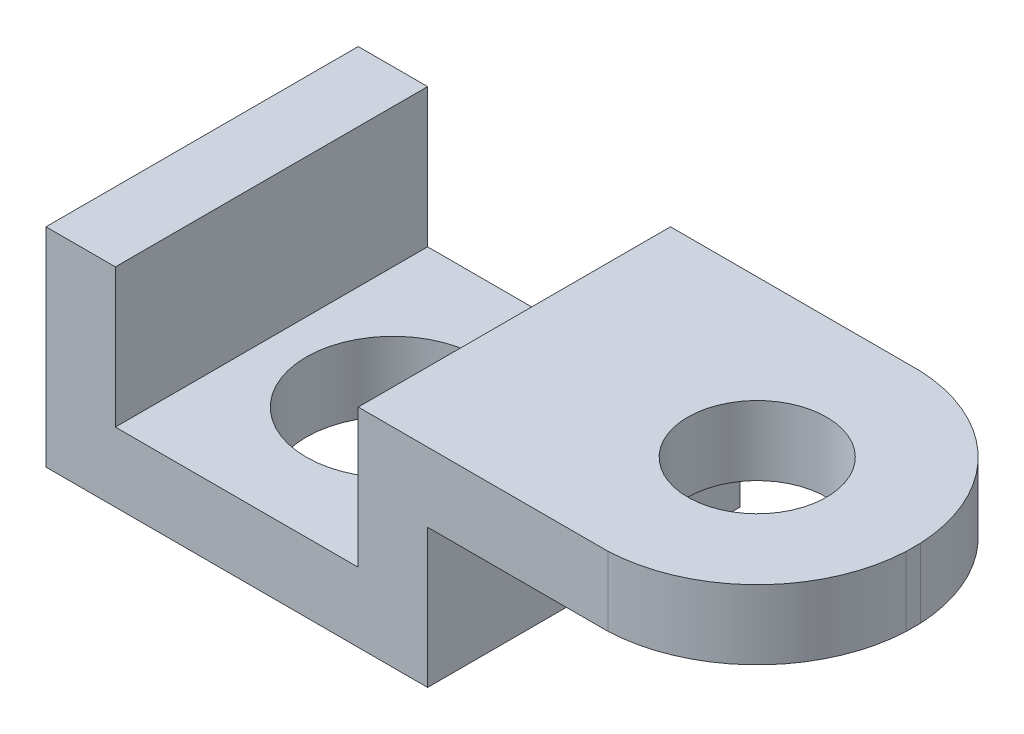
ISO-10303-21;
HEADER;
FILE_DESCRIPTION(('STEP AP214'),'2;1');
FILE_NAME('part.step','',(''),(''),'','','');
FILE_SCHEMA(('AUTOMOTIVE_DESIGN { 1 0 10303 214 1 1 1 1 }'));
ENDSEC;
DATA;
#1=APPLICATION_CONTEXT('core data for automotive mechanical design processes');
#2=APPLICATION_PROTOCOL_DEFINITION('international standard','automotive_design',2000,#1);
#3=PRODUCT_CONTEXT('',#1,'mechanical');
#4=PRODUCT('Part','Part','',(#3));
#5=PRODUCT_RELATED_PRODUCT_CATEGORY('part','',(#4));
#6=PRODUCT_DEFINITION_FORMATION('','',#4);
#7=PRODUCT_DEFINITION_CONTEXT('part definition',#1,'design');
#8=PRODUCT_DEFINITION('design','',#6,#7);
#9=PRODUCT_DEFINITION_SHAPE('','',#8);
#10=(LENGTH_UNIT() NAMED_UNIT(*) SI_UNIT(.MILLI.,.METRE.));
#11=(NAMED_UNIT(*) PLANE_ANGLE_UNIT() SI_UNIT($,.RADIAN.));
#12=(NAMED_UNIT(*) SI_UNIT($,.STERADIAN.) SOLID_ANGLE_UNIT());
#13=UNCERTAINTY_MEASURE_WITH_UNIT(LENGTH_MEASURE(1.E-05),#10,'distance_accuracy_value','');
#14=(GEOMETRIC_REPRESENTATION_CONTEXT(3) GLOBAL_UNCERTAINTY_ASSIGNED_CONTEXT((#13)) GLOBAL_UNIT_ASSIGNED_CONTEXT((#10,
#11,#12)) REPRESENTATION_CONTEXT('',''));
#15=CARTESIAN_POINT('',(0.,0.,0.));
#16=DIRECTION('',(0.,0.,1.));
#17=DIRECTION('',(1.,0.,0.));
#18=AXIS2_PLACEMENT_3D('',#15,#16,#17);
#19=CARTESIAN_POINT('',(0.,38.1,28.575));
#20=DIRECTION('',(1.,0.,0.));
#21=DIRECTION('',(0.,0.,-1.));
#22=AXIS2_PLACEMENT_3D('',#19,#20,#21);
#23=PLANE('',#22);
#24=DIRECTION('',(0.,-1.,0.));
#25=VECTOR('',#24,1.);
#26=CARTESIAN_POINT('',(0.,38.1,-28.575));
#27=LINE('',#26,#25);
#28=CARTESIAN_POINT('',(0.,38.1,-28.575));
#29=VERTEX_POINT('',#28);
#30=CARTESIAN_POINT('',(0.,0.,-28.575));
#31=VERTEX_POINT('',#30);
#32=EDGE_CURVE('E199',#29,#31,#27,.T.);
#33=ORIENTED_EDGE('',*,*,#32,.T.);
#34=DIRECTION('',(0.,0.,-1.));
#35=VECTOR('',#34,1.);
#36=CARTESIAN_POINT('',(0.,0.,28.575));
#37=LINE('',#36,#35);
#38=CARTESIAN_POINT('',(0.,0.,28.575));
#39=VERTEX_POINT('',#38);
#40=EDGE_CURVE('E12',#39,#31,#37,.T.);
#41=ORIENTED_EDGE('',*,*,#40,.F.);
#42=DIRECTION('',(0.,-1.,0.));
#43=VECTOR('',#42,1.);
#44=CARTESIAN_POINT('',(0.,38.1,28.575));
#45=LINE('',#44,#43);
#46=CARTESIAN_POINT('',(0.,38.1,28.575));
#47=VERTEX_POINT('',#46);
#48=EDGE_CURVE('E212',#47,#39,#45,.T.);
#49=ORIENTED_EDGE('',*,*,#48,.F.);
#50=DIRECTION('',(0.,0.,-1.));
#51=VECTOR('',#50,1.);
#52=CARTESIAN_POINT('',(0.,38.1,28.575));
#53=LINE('',#52,#51);
#54=EDGE_CURVE('E213',#47,#29,#53,.T.);
#55=ORIENTED_EDGE('',*,*,#54,.T.);
#56=EDGE_LOOP('',(#33,#41,#49,#55));
#57=FACE_BOUND('',#56,.T.);
#58=ADVANCED_FACE('F64',(#57),#23,.F.);
#59=CARTESIAN_POINT('',(0.,0.,28.575));
#60=DIRECTION('',(0.,1.,0.));
#61=DIRECTION('',(0.,0.,1.));
#62=AXIS2_PLACEMENT_3D('',#59,#60,#61);
#63=PLANE('',#62);
#64=CARTESIAN_POINT('',(34.925,0.,0.));
#65=DIRECTION('',(0.,1.,0.));
#66=DIRECTION('',(-1.,0.,0.));
#67=AXIS2_PLACEMENT_3D('',#64,#65,#66);
#68=CIRCLE('',#67,15.875);
#69=CARTESIAN_POINT('',(19.05,0.,0.));
#70=VERTEX_POINT('',#69);
#71=EDGE_CURVE('E255',#70,#70,#68,.T.);
#72=ORIENTED_EDGE('',*,*,#71,.T.);
#73=EDGE_LOOP('',(#72));
#74=FACE_BOUND('',#73,.T.);
#75=DIRECTION('',(1.,0.,0.));
#76=VECTOR('',#75,1.);
#77=CARTESIAN_POINT('',(0.,0.,-28.575));
#78=LINE('',#77,#76);
#79=CARTESIAN_POINT('',(69.85,0.,-28.575));
#80=VERTEX_POINT('',#79);
#81=EDGE_CURVE('E195',#31,#80,#78,.T.);
#82=ORIENTED_EDGE('',*,*,#81,.T.);
#83=DIRECTION('',(0.,0.,-1.));
#84=VECTOR('',#83,1.);
#85=CARTESIAN_POINT('',(69.85,0.,28.575));
#86=LINE('',#85,#84);
#87=CARTESIAN_POINT('',(69.85,0.,28.575));
#88=VERTEX_POINT('',#87);
#89=EDGE_CURVE('E71',#88,#80,#86,.T.);
#90=ORIENTED_EDGE('',*,*,#89,.F.);
#91=DIRECTION('',(1.,0.,0.));
#92=VECTOR('',#91,1.);
#93=CARTESIAN_POINT('',(0.,0.,28.575));
#94=LINE('',#93,#92);
#95=EDGE_CURVE('E271',#39,#88,#94,.T.);
#96=ORIENTED_EDGE('',*,*,#95,.F.);
#97=ORIENTED_EDGE('',*,*,#40,.T.);
#98=EDGE_LOOP('',(#82,#90,#96,#97));
#99=FACE_BOUND('',#98,.T.);
#100=ADVANCED_FACE('F304',(#74,#99),#63,.F.);
#101=CARTESIAN_POINT('',(69.85,0.,28.575));
#102=DIRECTION('',(-1.,0.,0.));
#103=DIRECTION('',(0.,0.,1.));
#104=AXIS2_PLACEMENT_3D('',#101,#102,#103);
#105=PLANE('',#104);
#106=DIRECTION('',(0.,1.,0.));
#107=VECTOR('',#106,1.);
#108=CARTESIAN_POINT('',(69.85,0.,-28.575));
#109=LINE('',#108,#107);
#110=CARTESIAN_POINT('',(69.85,25.4,-28.575));
#111=VERTEX_POINT('',#110);
#112=EDGE_CURVE('E188',#80,#111,#109,.T.);
#113=ORIENTED_EDGE('',*,*,#112,.T.);
#114=DIRECTION('',(0.,0.,-1.));
#115=VECTOR('',#114,1.);
#116=CARTESIAN_POINT('',(69.85,25.4,28.575));
#117=LINE('',#116,#115);
#118=CARTESIAN_POINT('',(69.85,25.4,28.575));
#119=VERTEX_POINT('',#118);
#120=EDGE_CURVE('E174',#119,#111,#117,.T.);
#121=ORIENTED_EDGE('',*,*,#120,.F.);
#122=DIRECTION('',(0.,1.,0.));
#123=VECTOR('',#122,1.);
#124=CARTESIAN_POINT('',(69.85,0.,28.575));
#125=LINE('',#124,#123);
#126=EDGE_CURVE('E189',#88,#119,#125,.T.);
#127=ORIENTED_EDGE('',*,*,#126,.F.);
#128=ORIENTED_EDGE('',*,*,#89,.T.);
#129=EDGE_LOOP('',(#113,#121,#127,#128));
#130=FACE_BOUND('',#129,.T.);
#131=ADVANCED_FACE('F186',(#130),#105,.F.);
#132=CARTESIAN_POINT('',(69.85,25.4,28.575));
#133=DIRECTION('',(0.,1.,0.));
#134=DIRECTION('',(-1.,0.,0.));
#135=AXIS2_PLACEMENT_3D('',#132,#133,#134);
#136=PLANE('',#135);
#137=CARTESIAN_POINT('',(101.6,25.4,0.));
#138=DIRECTION('',(0.,1.,0.));
#139=DIRECTION('',(-1.,0.,0.));
#140=AXIS2_PLACEMENT_3D('',#137,#138,#139);
#141=CIRCLE('',#140,12.7);
#142=CARTESIAN_POINT('',(88.9,25.4,0.));
#143=VERTEX_POINT('',#142);
#144=EDGE_CURVE('E264',#143,#143,#141,.T.);
#145=ORIENTED_EDGE('',*,*,#144,.T.);
#146=EDGE_LOOP('',(#145));
#147=FACE_BOUND('',#146,.T.);
#148=DIRECTION('',(0.,0.,-1.));
#149=VECTOR('',#148,1.);
#150=CARTESIAN_POINT('',(130.175,25.4,28.575));
#151=LINE('',#150,#149);
#152=CARTESIAN_POINT('',(130.175,25.4,1.2967476767075));
#153=VERTEX_POINT('',#152);
#154=CARTESIAN_POINT('',(130.175,25.4,-1.2967476767075));
#155=VERTEX_POINT('',#154);
#156=EDGE_CURVE('E166',#153,#155,#151,.T.);
#157=ORIENTED_EDGE('',*,*,#156,.F.);
#158=CARTESIAN_POINT('',(101.6,25.4,0.));
#159=DIRECTION('',(0.,1.,0.));
#160=DIRECTION('',(-1.,0.,0.));
#161=AXIS2_PLACEMENT_3D('',#158,#159,#160);
#162=CIRCLE('',#161,28.6044083934111);
#163=CARTESIAN_POINT('',(102.896747676707,25.4,28.575));
#164=VERTEX_POINT('',#163);
#165=EDGE_CURVE('E281',#153,#164,#162,.F.);
#166=ORIENTED_EDGE('',*,*,#165,.T.);
#167=DIRECTION('',(1.,0.,0.));
#168=VECTOR('',#167,1.);
#169=CARTESIAN_POINT('',(69.85,25.4,28.575));
#170=LINE('',#169,#168);
#171=EDGE_CURVE('E274',#119,#164,#170,.T.);
#172=ORIENTED_EDGE('',*,*,#171,.F.);
#173=ORIENTED_EDGE('',*,*,#120,.T.);
#174=DIRECTION('',(1.,0.,0.));
#175=VECTOR('',#174,1.);
#176=CARTESIAN_POINT('',(69.85,25.4,-28.575));
#177=LINE('',#176,#175);
#178=CARTESIAN_POINT('',(102.896747676707,25.4,-28.575));
#179=VERTEX_POINT('',#178);
#180=EDGE_CURVE('E169',#111,#179,#177,.T.);
#181=ORIENTED_EDGE('',*,*,#180,.T.);
#182=CARTESIAN_POINT('',(101.6,25.4,0.));
#183=DIRECTION('',(0.,1.,0.));
#184=DIRECTION('',(-1.,0.,0.));
#185=AXIS2_PLACEMENT_3D('',#182,#183,#184);
#186=CIRCLE('',#185,28.6044083934111);
#187=EDGE_CURVE('E86',#179,#155,#186,.F.);
#188=ORIENTED_EDGE('',*,*,#187,.T.);
#189=EDGE_LOOP('',(#157,#166,#172,#173,#181,#188));
#190=FACE_BOUND('',#189,.T.);
#191=ADVANCED_FACE('F164',(#147,#190),#136,.F.);
#192=CARTESIAN_POINT('',(130.175,25.4,28.575));
#193=DIRECTION('',(-1.,0.,0.));
#194=DIRECTION('',(0.,0.,1.));
#195=AXIS2_PLACEMENT_3D('',#192,#193,#194);
#196=PLANE('',#195);
#197=DIRECTION('',(0.,0.,-1.));
#198=VECTOR('',#197,1.);
#199=CARTESIAN_POINT('',(130.175,38.1,28.575));
#200=LINE('',#199,#198);
#201=CARTESIAN_POINT('',(130.175,38.1,1.2967476767075));
#202=VERTEX_POINT('',#201);
#203=CARTESIAN_POINT('',(130.175,38.1,-1.2967476767075));
#204=VERTEX_POINT('',#203);
#205=EDGE_CURVE('E175',#202,#204,#200,.T.);
#206=ORIENTED_EDGE('',*,*,#205,.F.);
#207=DIRECTION('',(0.,1.,0.));
#208=VECTOR('',#207,1.);
#209=CARTESIAN_POINT('',(130.175,25.4,1.2967476767075));
#210=LINE('',#209,#208);
#211=EDGE_CURVE('E173',#153,#202,#210,.T.);
#212=ORIENTED_EDGE('',*,*,#211,.F.);
#213=ORIENTED_EDGE('',*,*,#156,.T.);
#214=DIRECTION('',(0.,1.,0.));
#215=VECTOR('',#214,1.);
#216=CARTESIAN_POINT('',(130.175,25.4,-1.2967476767075));
#217=LINE('',#216,#215);
#218=EDGE_CURVE('E150',#155,#204,#217,.T.);
#219=ORIENTED_EDGE('',*,*,#218,.T.);
#220=EDGE_LOOP('',(#206,#212,#213,#219));
#221=FACE_BOUND('',#220,.T.);
#222=ADVANCED_FACE('F172',(#221),#196,.F.);
#223=CARTESIAN_POINT('',(130.175,38.1,28.575));
#224=DIRECTION('',(0.,-1.,0.));
#225=DIRECTION('',(1.,0.,0.));
#226=AXIS2_PLACEMENT_3D('',#223,#224,#225);
#227=PLANE('',#226);
#228=CARTESIAN_POINT('',(101.6,38.1,0.));
#229=DIRECTION('',(0.,1.,0.));
#230=DIRECTION('',(-1.,0.,0.));
#231=AXIS2_PLACEMENT_3D('',#228,#229,#230);
#232=CIRCLE('',#231,12.7);
#233=CARTESIAN_POINT('',(88.9,38.1,0.));
#234=VERTEX_POINT('',#233);
#235=EDGE_CURVE('E158',#234,#234,#232,.T.);
#236=ORIENTED_EDGE('',*,*,#235,.F.);
#237=EDGE_LOOP('',(#236));
#238=FACE_BOUND('',#237,.T.);
#239=DIRECTION('',(-1.,0.,0.));
#240=VECTOR('',#239,1.);
#241=CARTESIAN_POINT('',(130.175,38.1,28.575));
#242=LINE('',#241,#240);
#243=CARTESIAN_POINT('',(102.896747676707,38.1,28.575));
#244=VERTEX_POINT('',#243);
#245=CARTESIAN_POINT('',(57.15,38.1,28.575));
#246=VERTEX_POINT('',#245);
#247=EDGE_CURVE('E277',#244,#246,#242,.T.);
#248=ORIENTED_EDGE('',*,*,#247,.F.);
#249=CARTESIAN_POINT('',(101.6,38.1,0.));
#250=DIRECTION('',(0.,1.,0.));
#251=DIRECTION('',(-1.,0.,0.));
#252=AXIS2_PLACEMENT_3D('',#249,#250,#251);
#253=CIRCLE('',#252,28.6044083934111);
#254=EDGE_CURVE('E78',#202,#244,#253,.F.);
#255=ORIENTED_EDGE('',*,*,#254,.F.);
#256=ORIENTED_EDGE('',*,*,#205,.T.);
#257=CARTESIAN_POINT('',(101.6,38.1,0.));
#258=DIRECTION('',(0.,1.,0.));
#259=DIRECTION('',(-1.,0.,0.));
#260=AXIS2_PLACEMENT_3D('',#257,#258,#259);
#261=CIRCLE('',#260,28.6044083934111);
#262=CARTESIAN_POINT('',(102.896747676707,38.1,-28.575));
#263=VERTEX_POINT('',#262);
#264=EDGE_CURVE('E153',#263,#204,#261,.F.);
#265=ORIENTED_EDGE('',*,*,#264,.F.);
#266=DIRECTION('',(-1.,0.,0.));
#267=VECTOR('',#266,1.);
#268=CARTESIAN_POINT('',(130.175,38.1,-28.575));
#269=LINE('',#268,#267);
#270=CARTESIAN_POINT('',(57.15,38.1,-28.575));
#271=VERTEX_POINT('',#270);
#272=EDGE_CURVE('E197',#263,#271,#269,.T.);
#273=ORIENTED_EDGE('',*,*,#272,.T.);
#274=DIRECTION('',(0.,0.,-1.));
#275=VECTOR('',#274,1.);
#276=CARTESIAN_POINT('',(57.15,38.1,28.575));
#277=LINE('',#276,#275);
#278=EDGE_CURVE('E178',#246,#271,#277,.T.);
#279=ORIENTED_EDGE('',*,*,#278,.F.);
#280=EDGE_LOOP('',(#248,#255,#256,#265,#273,#279));
#281=FACE_BOUND('',#280,.T.);
#282=ADVANCED_FACE('F280',(#238,#281),#227,.F.);
#283=CARTESIAN_POINT('',(57.15,38.1,28.575));
#284=DIRECTION('',(1.,0.,0.));
#285=DIRECTION('',(0.,0.,-1.));
#286=AXIS2_PLACEMENT_3D('',#283,#284,#285);
#287=PLANE('',#286);
#288=DIRECTION('',(0.,-1.,0.));
#289=VECTOR('',#288,1.);
#290=CARTESIAN_POINT('',(57.15,38.1,-28.575));
#291=LINE('',#290,#289);
#292=CARTESIAN_POINT('',(57.15,12.7,-28.575));
#293=VERTEX_POINT('',#292);
#294=EDGE_CURVE('E204',#271,#293,#291,.T.);
#295=ORIENTED_EDGE('',*,*,#294,.T.);
#296=DIRECTION('',(0.,0.,-1.));
#297=VECTOR('',#296,1.);
#298=CARTESIAN_POINT('',(57.15,12.7,28.575));
#299=LINE('',#298,#297);
#300=CARTESIAN_POINT('',(57.15,12.7,28.575));
#301=VERTEX_POINT('',#300);
#302=EDGE_CURVE('E223',#301,#293,#299,.T.);
#303=ORIENTED_EDGE('',*,*,#302,.F.);
#304=DIRECTION('',(0.,-1.,0.));
#305=VECTOR('',#304,1.);
#306=CARTESIAN_POINT('',(57.15,38.1,28.575));
#307=LINE('',#306,#305);
#308=EDGE_CURVE('E232',#246,#301,#307,.T.);
#309=ORIENTED_EDGE('',*,*,#308,.F.);
#310=ORIENTED_EDGE('',*,*,#278,.T.);
#311=EDGE_LOOP('',(#295,#303,#309,#310));
#312=FACE_BOUND('',#311,.T.);
#313=ADVANCED_FACE('F230',(#312),#287,.F.);
#314=CARTESIAN_POINT('',(57.15,12.7,28.575));
#315=DIRECTION('',(0.,-1.,0.));
#316=DIRECTION('',(1.,0.,0.));
#317=AXIS2_PLACEMENT_3D('',#314,#315,#316);
#318=PLANE('',#317);
#319=CARTESIAN_POINT('',(34.925,12.7,0.));
#320=DIRECTION('',(0.,1.,0.));
#321=DIRECTION('',(-1.,0.,0.));
#322=AXIS2_PLACEMENT_3D('',#319,#320,#321);
#323=CIRCLE('',#322,15.875);
#324=CARTESIAN_POINT('',(19.05,12.7,0.));
#325=VERTEX_POINT('',#324);
#326=EDGE_CURVE('E259',#325,#325,#323,.T.);
#327=ORIENTED_EDGE('',*,*,#326,.F.);
#328=EDGE_LOOP('',(#327));
#329=FACE_BOUND('',#328,.T.);
#330=DIRECTION('',(-1.,0.,0.));
#331=VECTOR('',#330,1.);
#332=CARTESIAN_POINT('',(57.15,12.7,-28.575));
#333=LINE('',#332,#331);
#334=CARTESIAN_POINT('',(12.7,12.7,-28.575));
#335=VERTEX_POINT('',#334);
#336=EDGE_CURVE('E206',#293,#335,#333,.T.);
#337=ORIENTED_EDGE('',*,*,#336,.T.);
#338=DIRECTION('',(0.,0.,-1.));
#339=VECTOR('',#338,1.);
#340=CARTESIAN_POINT('',(12.7,12.7,28.575));
#341=LINE('',#340,#339);
#342=CARTESIAN_POINT('',(12.7,12.7,28.575));
#343=VERTEX_POINT('',#342);
#344=EDGE_CURVE('E220',#343,#335,#341,.T.);
#345=ORIENTED_EDGE('',*,*,#344,.F.);
#346=DIRECTION('',(-1.,0.,0.));
#347=VECTOR('',#346,1.);
#348=CARTESIAN_POINT('',(57.15,12.7,28.575));
#349=LINE('',#348,#347);
#350=EDGE_CURVE('E249',#301,#343,#349,.T.);
#351=ORIENTED_EDGE('',*,*,#350,.F.);
#352=ORIENTED_EDGE('',*,*,#302,.T.);
#353=EDGE_LOOP('',(#337,#345,#351,#352));
#354=FACE_BOUND('',#353,.T.);
#355=ADVANCED_FACE('F240',(#329,#354),#318,.F.);
#356=CARTESIAN_POINT('',(12.7,12.7,28.575));
#357=DIRECTION('',(-1.,0.,0.));
#358=DIRECTION('',(0.,-1.,0.));
#359=AXIS2_PLACEMENT_3D('',#356,#357,#358);
#360=PLANE('',#359);
#361=DIRECTION('',(0.,1.,0.));
#362=VECTOR('',#361,1.);
#363=CARTESIAN_POINT('',(12.7,12.7,-28.575));
#364=LINE('',#363,#362);
#365=CARTESIAN_POINT('',(12.7,38.1,-28.575));
#366=VERTEX_POINT('',#365);
#367=EDGE_CURVE('E208',#335,#366,#364,.T.);
#368=ORIENTED_EDGE('',*,*,#367,.T.);
#369=DIRECTION('',(0.,0.,-1.));
#370=VECTOR('',#369,1.);
#371=CARTESIAN_POINT('',(12.7,38.1,28.575));
#372=LINE('',#371,#370);
#373=CARTESIAN_POINT('',(12.7,38.1,28.575));
#374=VERTEX_POINT('',#373);
#375=EDGE_CURVE('E216',#374,#366,#372,.T.);
#376=ORIENTED_EDGE('',*,*,#375,.F.);
#377=DIRECTION('',(0.,1.,0.));
#378=VECTOR('',#377,1.);
#379=CARTESIAN_POINT('',(12.7,12.7,28.575));
#380=LINE('',#379,#378);
#381=EDGE_CURVE('E246',#343,#374,#380,.T.);
#382=ORIENTED_EDGE('',*,*,#381,.F.);
#383=ORIENTED_EDGE('',*,*,#344,.T.);
#384=EDGE_LOOP('',(#368,#376,#382,#383));
#385=FACE_BOUND('',#384,.T.);
#386=ADVANCED_FACE('F244',(#385),#360,.F.);
#387=CARTESIAN_POINT('',(12.7,38.1,28.575));
#388=DIRECTION('',(0.,-1.,0.));
#389=DIRECTION('',(0.,0.,-1.));
#390=AXIS2_PLACEMENT_3D('',#387,#388,#389);
#391=PLANE('',#390);
#392=DIRECTION('',(-1.,0.,0.));
#393=VECTOR('',#392,1.);
#394=CARTESIAN_POINT('',(12.7,38.1,-28.575));
#395=LINE('',#394,#393);
#396=EDGE_CURVE('E210',#366,#29,#395,.T.);
#397=ORIENTED_EDGE('',*,*,#396,.T.);
#398=ORIENTED_EDGE('',*,*,#54,.F.);
#399=DIRECTION('',(-1.,0.,0.));
#400=VECTOR('',#399,1.);
#401=CARTESIAN_POINT('',(12.7,38.1,28.575));
#402=LINE('',#401,#400);
#403=EDGE_CURVE('E217',#374,#47,#402,.T.);
#404=ORIENTED_EDGE('',*,*,#403,.F.);
#405=ORIENTED_EDGE('',*,*,#375,.T.);
#406=EDGE_LOOP('',(#397,#398,#404,#405));
#407=FACE_BOUND('',#406,.T.);
#408=ADVANCED_FACE('F339',(#407),#391,.F.);
#409=CARTESIAN_POINT('',(0.,0.,28.575));
#410=DIRECTION('',(0.,0.,1.));
#411=DIRECTION('',(1.,0.,0.));
#412=AXIS2_PLACEMENT_3D('',#409,#410,#411);
#413=PLANE('',#412);
#414=DIRECTION('',(0.,1.,0.));
#415=VECTOR('',#414,1.);
#416=CARTESIAN_POINT('',(102.896747676707,25.4,28.575));
#417=LINE('',#416,#415);
#418=EDGE_CURVE('E279',#164,#244,#417,.T.);
#419=ORIENTED_EDGE('',*,*,#418,.T.);
#420=ORIENTED_EDGE('',*,*,#247,.T.);
#421=ORIENTED_EDGE('',*,*,#308,.T.);
#422=ORIENTED_EDGE('',*,*,#350,.T.);
#423=ORIENTED_EDGE('',*,*,#381,.T.);
#424=ORIENTED_EDGE('',*,*,#403,.T.);
#425=ORIENTED_EDGE('',*,*,#48,.T.);
#426=ORIENTED_EDGE('',*,*,#95,.T.);
#427=ORIENTED_EDGE('',*,*,#126,.T.);
#428=ORIENTED_EDGE('',*,*,#171,.T.);
#429=EDGE_LOOP('',(#419,#420,#421,#422,#423,#424,#425,#426,#427,#428));
#430=FACE_BOUND('',#429,.T.);
#431=ADVANCED_FACE('F278',(#430),#413,.T.);
#432=CARTESIAN_POINT('',(0.,0.,-28.575));
#433=DIRECTION('',(0.,0.,1.));
#434=DIRECTION('',(1.,0.,0.));
#435=AXIS2_PLACEMENT_3D('',#432,#433,#434);
#436=PLANE('',#435);
#437=ORIENTED_EDGE('',*,*,#272,.F.);
#438=DIRECTION('',(0.,1.,0.));
#439=VECTOR('',#438,1.);
#440=CARTESIAN_POINT('',(102.896747676707,25.4,-28.575));
#441=LINE('',#440,#439);
#442=EDGE_CURVE('E159',#179,#263,#441,.T.);
#443=ORIENTED_EDGE('',*,*,#442,.F.);
#444=ORIENTED_EDGE('',*,*,#180,.F.);
#445=ORIENTED_EDGE('',*,*,#112,.F.);
#446=ORIENTED_EDGE('',*,*,#81,.F.);
#447=ORIENTED_EDGE('',*,*,#32,.F.);
#448=ORIENTED_EDGE('',*,*,#396,.F.);
#449=ORIENTED_EDGE('',*,*,#367,.F.);
#450=ORIENTED_EDGE('',*,*,#336,.F.);
#451=ORIENTED_EDGE('',*,*,#294,.F.);
#452=EDGE_LOOP('',(#437,#443,#444,#445,#446,#447,#448,#449,#450,#451));
#453=FACE_BOUND('',#452,.T.);
#454=ADVANCED_FACE('F193',(#453),#436,.F.);
#455=CARTESIAN_POINT('',(34.925,0.,0.));
#456=DIRECTION('',(0.,1.,0.));
#457=DIRECTION('',(-1.,0.,0.));
#458=AXIS2_PLACEMENT_3D('',#455,#456,#457);
#459=CYLINDRICAL_SURFACE('',#458,15.875);
#460=ORIENTED_EDGE('',*,*,#71,.F.);
#461=EDGE_LOOP('',(#460));
#462=FACE_BOUND('',#461,.T.);
#463=ORIENTED_EDGE('',*,*,#326,.T.);
#464=EDGE_LOOP('',(#463));
#465=FACE_BOUND('',#464,.T.);
#466=ADVANCED_FACE('F351',(#462,#465),#459,.F.);
#467=CARTESIAN_POINT('',(101.6,25.4,0.));
#468=DIRECTION('',(0.,1.,0.));
#469=DIRECTION('',(-1.,0.,0.));
#470=AXIS2_PLACEMENT_3D('',#467,#468,#469);
#471=CYLINDRICAL_SURFACE('',#470,28.6044083934111);
#472=ORIENTED_EDGE('',*,*,#264,.T.);
#473=ORIENTED_EDGE('',*,*,#218,.F.);
#474=ORIENTED_EDGE('',*,*,#187,.F.);
#475=ORIENTED_EDGE('',*,*,#442,.T.);
#476=EDGE_LOOP('',(#472,#473,#474,#475));
#477=FACE_BOUND('',#476,.T.);
#478=ADVANCED_FACE('F151',(#477),#471,.T.);
#479=CARTESIAN_POINT('',(101.6,25.4,0.));
#480=DIRECTION('',(0.,1.,0.));
#481=DIRECTION('',(-1.,0.,0.));
#482=AXIS2_PLACEMENT_3D('',#479,#480,#481);
#483=CYLINDRICAL_SURFACE('',#482,28.6044083934111);
#484=ORIENTED_EDGE('',*,*,#254,.T.);
#485=ORIENTED_EDGE('',*,*,#418,.F.);
#486=ORIENTED_EDGE('',*,*,#165,.F.);
#487=ORIENTED_EDGE('',*,*,#211,.T.);
#488=EDGE_LOOP('',(#484,#485,#486,#487));
#489=FACE_BOUND('',#488,.T.);
#490=ADVANCED_FACE('F363',(#489),#483,.T.);
#491=CARTESIAN_POINT('',(101.6,25.4,0.));
#492=DIRECTION('',(0.,1.,0.));
#493=DIRECTION('',(-1.,0.,0.));
#494=AXIS2_PLACEMENT_3D('',#491,#492,#493);
#495=CYLINDRICAL_SURFACE('',#494,12.7);
#496=ORIENTED_EDGE('',*,*,#144,.F.);
#497=EDGE_LOOP('',(#496));
#498=FACE_BOUND('',#497,.T.);
#499=ORIENTED_EDGE('',*,*,#235,.T.);
#500=EDGE_LOOP('',(#499));
#501=FACE_BOUND('',#500,.T.);
#502=ADVANCED_FACE('F293',(#498,#501),#495,.F.);
#503=CLOSED_SHELL('',(#58,#100,#131,#191,#222,#282,#313,#355,#386,#408,#431,#454,#466,#478,#490,#502));
#504=MANIFOLD_SOLID_BREP('B2',#503);
#505=ADVANCED_BREP_SHAPE_REPRESENTATION('',(#18,#504),#14);
#506=SHAPE_DEFINITION_REPRESENTATION(#9,#505);
ENDSEC;
END-ISO-10303-21;
